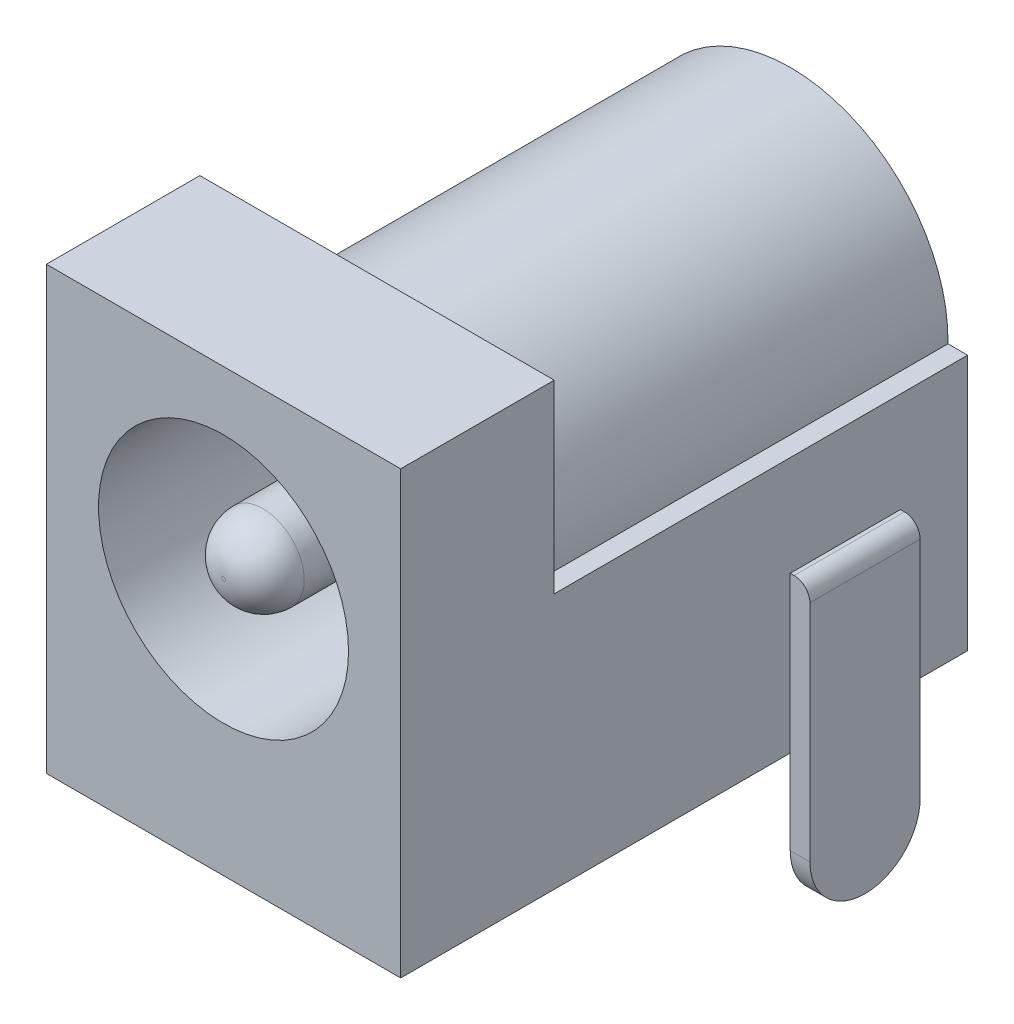
ISO-10303-21;
HEADER;
FILE_DESCRIPTION(('STEP AP214'),'2;1');
FILE_NAME('part.step','',(''),(''),'','','');
FILE_SCHEMA(('AUTOMOTIVE_DESIGN { 1 0 10303 214 1 1 1 1 }'));
ENDSEC;
DATA;
#1=APPLICATION_CONTEXT('core data for automotive mechanical design processes');
#2=APPLICATION_PROTOCOL_DEFINITION('international standard','automotive_design',2000,#1);
#3=PRODUCT_CONTEXT('',#1,'mechanical');
#4=PRODUCT('Part','Part','',(#3));
#5=PRODUCT_RELATED_PRODUCT_CATEGORY('part','',(#4));
#6=PRODUCT_DEFINITION_FORMATION('','',#4);
#7=PRODUCT_DEFINITION_CONTEXT('part definition',#1,'design');
#8=PRODUCT_DEFINITION('design','',#6,#7);
#9=PRODUCT_DEFINITION_SHAPE('','',#8);
#10=(LENGTH_UNIT() NAMED_UNIT(*) SI_UNIT(.MILLI.,.METRE.));
#11=(NAMED_UNIT(*) PLANE_ANGLE_UNIT() SI_UNIT($,.RADIAN.));
#12=(NAMED_UNIT(*) SI_UNIT($,.STERADIAN.) SOLID_ANGLE_UNIT());
#13=UNCERTAINTY_MEASURE_WITH_UNIT(LENGTH_MEASURE(1.E-05),#10,'distance_accuracy_value','');
#14=(GEOMETRIC_REPRESENTATION_CONTEXT(3) GLOBAL_UNCERTAINTY_ASSIGNED_CONTEXT((#13)) GLOBAL_UNIT_ASSIGNED_CONTEXT((#10,
#11,#12)) REPRESENTATION_CONTEXT('',''));
#15=CARTESIAN_POINT('',(0.,0.,0.));
#16=DIRECTION('',(0.,0.,1.));
#17=DIRECTION('',(1.,0.,0.));
#18=AXIS2_PLACEMENT_3D('',#15,#16,#17);
#19=CARTESIAN_POINT('',(9.04354924437719,4.,-9.85));
#20=DIRECTION('',(-1.,0.,0.));
#21=DIRECTION('',(0.,0.,1.));
#22=AXIS2_PLACEMENT_3D('',#19,#20,#21);
#23=PLANE('',#22);
#24=CARTESIAN_POINT('',(9.04354924437719,-2.1,-11.25));
#25=DIRECTION('',(-1.,0.,0.));
#26=DIRECTION('',(0.,0.,1.));
#27=AXIS2_PLACEMENT_3D('',#24,#25,#26);
#28=CIRCLE('',#27,1.4);
#29=CARTESIAN_POINT('',(9.04354924437719,-2.1,-12.65));
#30=VERTEX_POINT('',#29);
#31=CARTESIAN_POINT('',(9.04354924437719,-3.5,-11.25));
#32=VERTEX_POINT('',#31);
#33=EDGE_CURVE('E132',#30,#32,#28,.T.);
#34=ORIENTED_EDGE('',*,*,#33,.T.);
#35=CARTESIAN_POINT('',(9.04354924437719,-2.1,-11.25));
#36=DIRECTION('',(-1.,0.,0.));
#37=DIRECTION('',(0.,0.,1.));
#38=AXIS2_PLACEMENT_3D('',#35,#36,#37);
#39=CIRCLE('',#38,1.4);
#40=CARTESIAN_POINT('',(9.04354924437719,-2.1,-9.85));
#41=VERTEX_POINT('',#40);
#42=EDGE_CURVE('E134',#32,#41,#39,.T.);
#43=ORIENTED_EDGE('',*,*,#42,.T.);
#44=DIRECTION('',(0.,-1.,0.));
#45=VECTOR('',#44,1.);
#46=CARTESIAN_POINT('',(9.04354924437719,4.,-9.85));
#47=LINE('',#46,#45);
#48=CARTESIAN_POINT('',(9.04354924437719,4.,-9.85));
#49=VERTEX_POINT('',#48);
#50=EDGE_CURVE('E115',#49,#41,#47,.T.);
#51=ORIENTED_EDGE('',*,*,#50,.F.);
#52=DIRECTION('',(0.,0.,-1.));
#53=VECTOR('',#52,1.);
#54=CARTESIAN_POINT('',(9.04354924437719,4.,-9.85));
#55=LINE('',#54,#53);
#56=CARTESIAN_POINT('',(9.04354924437719,4.,-12.65));
#57=VERTEX_POINT('',#56);
#58=EDGE_CURVE('E109',#49,#57,#55,.T.);
#59=ORIENTED_EDGE('',*,*,#58,.T.);
#60=DIRECTION('',(0.,-1.,0.));
#61=VECTOR('',#60,1.);
#62=CARTESIAN_POINT('',(9.04354924437719,4.,-12.65));
#63=LINE('',#62,#61);
#64=EDGE_CURVE('E93',#57,#30,#63,.T.);
#65=ORIENTED_EDGE('',*,*,#64,.T.);
#66=EDGE_LOOP('',(#34,#43,#51,#59,#65));
#67=FACE_BOUND('',#66,.T.);
#68=ADVANCED_FACE('F42',(#67),#23,.T.);
#69=CARTESIAN_POINT('',(9.04354924437719,4.,-9.85));
#70=DIRECTION('',(0.,0.,1.));
#71=DIRECTION('',(1.,0.,0.));
#72=AXIS2_PLACEMENT_3D('',#69,#70,#71);
#73=PLANE('',#72);
#74=ORIENTED_EDGE('',*,*,#50,.T.);
#75=DIRECTION('',(-1.,0.,0.));
#76=VECTOR('',#75,1.);
#77=CARTESIAN_POINT('',(9.04354924437719,-2.1,-9.85));
#78=LINE('',#77,#76);
#79=CARTESIAN_POINT('',(9.54354924437719,-2.1,-9.85));
#80=VERTEX_POINT('',#79);
#81=EDGE_CURVE('E136',#41,#80,#78,.F.);
#82=ORIENTED_EDGE('',*,*,#81,.T.);
#83=DIRECTION('',(0.,-1.,0.));
#84=VECTOR('',#83,1.);
#85=CARTESIAN_POINT('',(9.54354924437719,4.,-9.85));
#86=LINE('',#85,#84);
#87=CARTESIAN_POINT('',(9.54354924437719,3.6,-9.85));
#88=VERTEX_POINT('',#87);
#89=EDGE_CURVE('E122',#88,#80,#86,.T.);
#90=ORIENTED_EDGE('',*,*,#89,.F.);
#91=CARTESIAN_POINT('',(9.14354924437719,3.6,-9.85));
#92=DIRECTION('',(0.,0.,1.));
#93=DIRECTION('',(1.,0.,0.));
#94=AXIS2_PLACEMENT_3D('',#91,#92,#93);
#95=CIRCLE('',#94,0.4);
#96=CARTESIAN_POINT('',(9.14354924437719,4.,-9.85));
#97=VERTEX_POINT('',#96);
#98=EDGE_CURVE('E127',#88,#97,#95,.T.);
#99=ORIENTED_EDGE('',*,*,#98,.T.);
#100=DIRECTION('',(-1.,0.,0.));
#101=VECTOR('',#100,1.);
#102=CARTESIAN_POINT('',(9.04354924437719,4.,-9.85));
#103=LINE('',#102,#101);
#104=EDGE_CURVE('E103',#97,#49,#103,.T.);
#105=ORIENTED_EDGE('',*,*,#104,.T.);
#106=EDGE_LOOP('',(#74,#82,#90,#99,#105));
#107=FACE_BOUND('',#106,.T.);
#108=ADVANCED_FACE('F143',(#107),#73,.T.);
#109=CARTESIAN_POINT('',(9.54354924437719,4.,-9.85));
#110=DIRECTION('',(1.,0.,0.));
#111=DIRECTION('',(0.,0.,-1.));
#112=AXIS2_PLACEMENT_3D('',#109,#110,#111);
#113=PLANE('',#112);
#114=ORIENTED_EDGE('',*,*,#89,.T.);
#115=CARTESIAN_POINT('',(9.54354924437719,-2.1,-11.25));
#116=DIRECTION('',(1.,0.,0.));
#117=DIRECTION('',(0.,0.,-1.));
#118=AXIS2_PLACEMENT_3D('',#115,#116,#117);
#119=CIRCLE('',#118,1.4);
#120=CARTESIAN_POINT('',(9.54354924437719,-3.5,-11.25));
#121=VERTEX_POINT('',#120);
#122=EDGE_CURVE('E51',#80,#121,#119,.T.);
#123=ORIENTED_EDGE('',*,*,#122,.T.);
#124=CARTESIAN_POINT('',(9.54354924437719,-2.1,-11.25));
#125=DIRECTION('',(1.,0.,0.));
#126=DIRECTION('',(0.,0.,-1.));
#127=AXIS2_PLACEMENT_3D('',#124,#125,#126);
#128=CIRCLE('',#127,1.4);
#129=CARTESIAN_POINT('',(9.54354924437719,-2.1,-12.65));
#130=VERTEX_POINT('',#129);
#131=EDGE_CURVE('E61',#121,#130,#128,.T.);
#132=ORIENTED_EDGE('',*,*,#131,.T.);
#133=DIRECTION('',(0.,-1.,0.));
#134=VECTOR('',#133,1.);
#135=CARTESIAN_POINT('',(9.54354924437719,4.,-12.65));
#136=LINE('',#135,#134);
#137=CARTESIAN_POINT('',(9.54354924437719,3.6,-12.65));
#138=VERTEX_POINT('',#137);
#139=EDGE_CURVE('E102',#138,#130,#136,.T.);
#140=ORIENTED_EDGE('',*,*,#139,.F.);
#141=DIRECTION('',(0.,0.,1.));
#142=VECTOR('',#141,1.);
#143=CARTESIAN_POINT('',(9.54354924437719,3.6,-9.85));
#144=LINE('',#143,#142);
#145=EDGE_CURVE('E121',#138,#88,#144,.T.);
#146=ORIENTED_EDGE('',*,*,#145,.T.);
#147=EDGE_LOOP('',(#114,#123,#132,#140,#146));
#148=FACE_BOUND('',#147,.T.);
#149=ADVANCED_FACE('F146',(#148),#113,.T.);
#150=CARTESIAN_POINT('',(9.04354924437719,4.,-12.65));
#151=DIRECTION('',(0.,0.,-1.));
#152=DIRECTION('',(-1.,0.,0.));
#153=AXIS2_PLACEMENT_3D('',#150,#151,#152);
#154=PLANE('',#153);
#155=ORIENTED_EDGE('',*,*,#139,.T.);
#156=DIRECTION('',(1.,0.,0.));
#157=VECTOR('',#156,1.);
#158=CARTESIAN_POINT('',(9.04354924437719,-2.1,-12.65));
#159=LINE('',#158,#157);
#160=EDGE_CURVE('E12',#130,#30,#159,.F.);
#161=ORIENTED_EDGE('',*,*,#160,.T.);
#162=ORIENTED_EDGE('',*,*,#64,.F.);
#163=DIRECTION('',(1.,0.,0.));
#164=VECTOR('',#163,1.);
#165=CARTESIAN_POINT('',(9.04354924437719,4.,-12.65));
#166=LINE('',#165,#164);
#167=CARTESIAN_POINT('',(9.14354924437719,4.,-12.65));
#168=VERTEX_POINT('',#167);
#169=EDGE_CURVE('E96',#57,#168,#166,.T.);
#170=ORIENTED_EDGE('',*,*,#169,.T.);
#171=CARTESIAN_POINT('',(9.14354924437719,3.6,-12.65));
#172=DIRECTION('',(0.,0.,-1.));
#173=DIRECTION('',(-1.,0.,0.));
#174=AXIS2_PLACEMENT_3D('',#171,#172,#173);
#175=CIRCLE('',#174,0.4);
#176=EDGE_CURVE('E130',#168,#138,#175,.T.);
#177=ORIENTED_EDGE('',*,*,#176,.T.);
#178=EDGE_LOOP('',(#155,#161,#162,#170,#177));
#179=FACE_BOUND('',#178,.T.);
#180=ADVANCED_FACE('F95',(#179),#154,.T.);
#181=CARTESIAN_POINT('',(0.,4.,0.));
#182=DIRECTION('',(0.,-1.,0.));
#183=DIRECTION('',(0.,0.,-1.));
#184=AXIS2_PLACEMENT_3D('',#181,#182,#183);
#185=PLANE('',#184);
#186=ORIENTED_EDGE('',*,*,#104,.F.);
#187=DIRECTION('',(0.,0.,1.));
#188=VECTOR('',#187,1.);
#189=CARTESIAN_POINT('',(9.14354924437719,4.,-12.65));
#190=LINE('',#189,#188);
#191=EDGE_CURVE('E111',#97,#168,#190,.F.);
#192=ORIENTED_EDGE('',*,*,#191,.T.);
#193=ORIENTED_EDGE('',*,*,#169,.F.);
#194=ORIENTED_EDGE('',*,*,#58,.F.);
#195=EDGE_LOOP('',(#186,#192,#193,#194));
#196=FACE_BOUND('',#195,.T.);
#197=ADVANCED_FACE('F108',(#196),#185,.F.);
#198=CARTESIAN_POINT('',(9.14354924437719,3.6,-9.85));
#199=DIRECTION('',(0.,0.,-1.));
#200=DIRECTION('',(-1.,0.,0.));
#201=AXIS2_PLACEMENT_3D('',#198,#199,#200);
#202=CYLINDRICAL_SURFACE('',#201,0.4);
#203=ORIENTED_EDGE('',*,*,#176,.F.);
#204=ORIENTED_EDGE('',*,*,#191,.F.);
#205=ORIENTED_EDGE('',*,*,#98,.F.);
#206=ORIENTED_EDGE('',*,*,#145,.F.);
#207=EDGE_LOOP('',(#203,#204,#205,#206));
#208=FACE_BOUND('',#207,.T.);
#209=ADVANCED_FACE('F149',(#208),#202,.T.);
#210=CARTESIAN_POINT('',(0.,-2.1,-11.25));
#211=DIRECTION('',(1.,0.,0.));
#212=DIRECTION('',(0.,0.,-1.));
#213=AXIS2_PLACEMENT_3D('',#210,#211,#212);
#214=CYLINDRICAL_SURFACE('',#213,1.4);
#215=ORIENTED_EDGE('',*,*,#160,.F.);
#216=ORIENTED_EDGE('',*,*,#131,.F.);
#217=DIRECTION('',(1.,0.,0.));
#218=VECTOR('',#217,1.);
#219=CARTESIAN_POINT('',(0.,-3.5,-11.25));
#220=LINE('',#219,#218);
#221=EDGE_CURVE('E46',#32,#121,#220,.T.);
#222=ORIENTED_EDGE('',*,*,#221,.F.);
#223=ORIENTED_EDGE('',*,*,#33,.F.);
#224=EDGE_LOOP('',(#215,#216,#222,#223));
#225=FACE_BOUND('',#224,.T.);
#226=ADVANCED_FACE('F44',(#225),#214,.T.);
#227=CARTESIAN_POINT('',(0.,-2.1,-11.25));
#228=DIRECTION('',(-1.,0.,0.));
#229=DIRECTION('',(0.,0.,1.));
#230=AXIS2_PLACEMENT_3D('',#227,#228,#229);
#231=CYLINDRICAL_SURFACE('',#230,1.4);
#232=ORIENTED_EDGE('',*,*,#122,.F.);
#233=ORIENTED_EDGE('',*,*,#81,.F.);
#234=ORIENTED_EDGE('',*,*,#42,.F.);
#235=ORIENTED_EDGE('',*,*,#221,.T.);
#236=EDGE_LOOP('',(#232,#233,#234,#235));
#237=FACE_BOUND('',#236,.T.);
#238=ADVANCED_FACE('F152',(#237),#231,.T.);
#239=CLOSED_SHELL('',(#68,#108,#149,#180,#197,#209,#226,#238));
#240=MANIFOLD_SOLID_BREP('B2',#239);
#241=CARTESIAN_POINT('',(4.5,6.525,-10.));
#242=DIRECTION('',(0.,0.,1.));
#243=DIRECTION('',(1.,0.,0.));
#244=AXIS2_PLACEMENT_3D('',#241,#242,#243);
#245=PLANE('',#244);
#246=CARTESIAN_POINT('',(4.5,6.525,-10.));
#247=DIRECTION('',(0.,0.,1.));
#248=DIRECTION('',(1.,0.,0.));
#249=AXIS2_PLACEMENT_3D('',#246,#247,#248);
#250=CIRCLE('',#249,3.175);
#251=CARTESIAN_POINT('',(7.675,6.525,-10.));
#252=VERTEX_POINT('',#251);
#253=EDGE_CURVE('E473',#252,#252,#250,.T.);
#254=ORIENTED_EDGE('',*,*,#253,.T.);
#255=EDGE_LOOP('',(#254));
#256=FACE_BOUND('',#255,.T.);
#257=CARTESIAN_POINT('',(4.5,6.525,-10.));
#258=DIRECTION('',(0.,0.,1.));
#259=DIRECTION('',(1.,0.,0.));
#260=AXIS2_PLACEMENT_3D('',#257,#258,#259);
#261=CIRCLE('',#260,1.05);
#262=CARTESIAN_POINT('',(5.55,6.525,-10.));
#263=VERTEX_POINT('',#262);
#264=EDGE_CURVE('E463',#263,#263,#261,.T.);
#265=ORIENTED_EDGE('',*,*,#264,.F.);
#266=EDGE_LOOP('',(#265));
#267=FACE_BOUND('',#266,.T.);
#268=ADVANCED_FACE('F217',(#256,#267),#245,.T.);
#269=CARTESIAN_POINT('',(0.,11.2,0.));
#270=DIRECTION('',(1.,0.,0.));
#271=DIRECTION('',(0.,0.,-1.));
#272=AXIS2_PLACEMENT_3D('',#269,#270,#271);
#273=PLANE('',#272);
#274=DIRECTION('',(0.,1.,0.));
#275=VECTOR('',#274,1.);
#276=CARTESIAN_POINT('',(0.,11.2,-3.9));
#277=LINE('',#276,#275);
#278=CARTESIAN_POINT('',(0.,6.5,-3.9));
#279=VERTEX_POINT('',#278);
#280=CARTESIAN_POINT('',(0.,11.2,-3.9));
#281=VERTEX_POINT('',#280);
#282=EDGE_CURVE('E447',#279,#281,#277,.T.);
#283=ORIENTED_EDGE('',*,*,#282,.F.);
#284=DIRECTION('',(0.,0.,-1.));
#285=VECTOR('',#284,1.);
#286=CARTESIAN_POINT('',(0.,6.5,-3.9));
#287=LINE('',#286,#285);
#288=CARTESIAN_POINT('',(0.,6.5,-14.4));
#289=VERTEX_POINT('',#288);
#290=EDGE_CURVE('E464',#279,#289,#287,.T.);
#291=ORIENTED_EDGE('',*,*,#290,.T.);
#292=DIRECTION('',(0.,-1.,0.));
#293=VECTOR('',#292,1.);
#294=CARTESIAN_POINT('',(0.,11.2,-14.4));
#295=LINE('',#294,#293);
#296=CARTESIAN_POINT('',(0.,0.,-14.4));
#297=VERTEX_POINT('',#296);
#298=EDGE_CURVE('E487',#289,#297,#295,.T.);
#299=ORIENTED_EDGE('',*,*,#298,.T.);
#300=DIRECTION('',(0.,0.,1.));
#301=VECTOR('',#300,1.);
#302=CARTESIAN_POINT('',(0.,0.,0.));
#303=LINE('',#302,#301);
#304=CARTESIAN_POINT('',(0.,0.,0.));
#305=VERTEX_POINT('',#304);
#306=EDGE_CURVE('E476',#297,#305,#303,.T.);
#307=ORIENTED_EDGE('',*,*,#306,.T.);
#308=DIRECTION('',(0.,-1.,0.));
#309=VECTOR('',#308,1.);
#310=CARTESIAN_POINT('',(0.,11.2,0.));
#311=LINE('',#310,#309);
#312=CARTESIAN_POINT('',(0.,11.2,0.));
#313=VERTEX_POINT('',#312);
#314=EDGE_CURVE('E503',#313,#305,#311,.T.);
#315=ORIENTED_EDGE('',*,*,#314,.F.);
#316=DIRECTION('',(0.,0.,1.));
#317=VECTOR('',#316,1.);
#318=CARTESIAN_POINT('',(0.,11.2,0.));
#319=LINE('',#318,#317);
#320=EDGE_CURVE('E479',#281,#313,#319,.T.);
#321=ORIENTED_EDGE('',*,*,#320,.F.);
#322=EDGE_LOOP('',(#283,#291,#299,#307,#315,#321));
#323=FACE_BOUND('',#322,.T.);
#324=ADVANCED_FACE('F577',(#323),#273,.F.);
#325=CARTESIAN_POINT('',(0.,11.2,0.));
#326=DIRECTION('',(0.,0.,-1.));
#327=DIRECTION('',(-1.,0.,0.));
#328=AXIS2_PLACEMENT_3D('',#325,#326,#327);
#329=PLANE('',#328);
#330=CARTESIAN_POINT('',(4.5,6.525,0.));
#331=DIRECTION('',(0.,0.,1.));
#332=DIRECTION('',(1.,0.,0.));
#333=AXIS2_PLACEMENT_3D('',#330,#331,#332);
#334=CIRCLE('',#333,3.175);
#335=CARTESIAN_POINT('',(7.675,6.525,0.));
#336=VERTEX_POINT('',#335);
#337=EDGE_CURVE('E472',#336,#336,#334,.T.);
#338=ORIENTED_EDGE('',*,*,#337,.F.);
#339=EDGE_LOOP('',(#338));
#340=FACE_BOUND('',#339,.T.);
#341=DIRECTION('',(1.,0.,0.));
#342=VECTOR('',#341,1.);
#343=CARTESIAN_POINT('',(0.,0.,0.));
#344=LINE('',#343,#342);
#345=CARTESIAN_POINT('',(9.,0.,0.));
#346=VERTEX_POINT('',#345);
#347=EDGE_CURVE('E490',#305,#346,#344,.T.);
#348=ORIENTED_EDGE('',*,*,#347,.T.);
#349=DIRECTION('',(0.,-1.,0.));
#350=VECTOR('',#349,1.);
#351=CARTESIAN_POINT('',(9.,11.2,0.));
#352=LINE('',#351,#350);
#353=CARTESIAN_POINT('',(9.,11.2,0.));
#354=VERTEX_POINT('',#353);
#355=EDGE_CURVE('E500',#354,#346,#352,.T.);
#356=ORIENTED_EDGE('',*,*,#355,.F.);
#357=DIRECTION('',(1.,0.,0.));
#358=VECTOR('',#357,1.);
#359=CARTESIAN_POINT('',(0.,11.2,0.));
#360=LINE('',#359,#358);
#361=EDGE_CURVE('E481',#313,#354,#360,.T.);
#362=ORIENTED_EDGE('',*,*,#361,.F.);
#363=ORIENTED_EDGE('',*,*,#314,.T.);
#364=EDGE_LOOP('',(#348,#356,#362,#363));
#365=FACE_BOUND('',#364,.T.);
#366=ADVANCED_FACE('F583',(#340,#365),#329,.F.);
#367=CARTESIAN_POINT('',(9.,11.2,0.));
#368=DIRECTION('',(-1.,0.,0.));
#369=DIRECTION('',(0.,0.,1.));
#370=AXIS2_PLACEMENT_3D('',#367,#368,#369);
#371=PLANE('',#370);
#372=DIRECTION('',(0.,-1.,0.));
#373=VECTOR('',#372,1.);
#374=CARTESIAN_POINT('',(9.,11.2,-14.4));
#375=LINE('',#374,#373);
#376=CARTESIAN_POINT('',(9.,6.5,-14.4));
#377=VERTEX_POINT('',#376);
#378=CARTESIAN_POINT('',(9.,0.,-14.4));
#379=VERTEX_POINT('',#378);
#380=EDGE_CURVE('E498',#377,#379,#375,.T.);
#381=ORIENTED_EDGE('',*,*,#380,.F.);
#382=DIRECTION('',(0.,0.,-1.));
#383=VECTOR('',#382,1.);
#384=CARTESIAN_POINT('',(9.,6.5,-3.9));
#385=LINE('',#384,#383);
#386=CARTESIAN_POINT('',(9.,6.5,-3.9));
#387=VERTEX_POINT('',#386);
#388=EDGE_CURVE('E461',#387,#377,#385,.T.);
#389=ORIENTED_EDGE('',*,*,#388,.F.);
#390=DIRECTION('',(0.,-1.,0.));
#391=VECTOR('',#390,1.);
#392=CARTESIAN_POINT('',(9.,6.5,-3.9));
#393=LINE('',#392,#391);
#394=CARTESIAN_POINT('',(9.,11.2,-3.9));
#395=VERTEX_POINT('',#394);
#396=EDGE_CURVE('E451',#395,#387,#393,.T.);
#397=ORIENTED_EDGE('',*,*,#396,.F.);
#398=DIRECTION('',(0.,0.,-1.));
#399=VECTOR('',#398,1.);
#400=CARTESIAN_POINT('',(9.,11.2,0.));
#401=LINE('',#400,#399);
#402=EDGE_CURVE('E484',#354,#395,#401,.T.);
#403=ORIENTED_EDGE('',*,*,#402,.F.);
#404=ORIENTED_EDGE('',*,*,#355,.T.);
#405=DIRECTION('',(0.,0.,-1.));
#406=VECTOR('',#405,1.);
#407=CARTESIAN_POINT('',(9.,0.,0.));
#408=LINE('',#407,#406);
#409=EDGE_CURVE('E492',#346,#379,#408,.T.);
#410=ORIENTED_EDGE('',*,*,#409,.T.);
#411=EDGE_LOOP('',(#381,#389,#397,#403,#404,#410));
#412=FACE_BOUND('',#411,.T.);
#413=ADVANCED_FACE('F604',(#412),#371,.F.);
#414=CARTESIAN_POINT('',(0.,11.2,-14.4));
#415=DIRECTION('',(0.,0.,1.));
#416=DIRECTION('',(1.,0.,0.));
#417=AXIS2_PLACEMENT_3D('',#414,#415,#416);
#418=PLANE('',#417);
#419=CARTESIAN_POINT('',(4.5,6.57744832748208,-14.4));
#420=DIRECTION('',(0.,0.,1.));
#421=DIRECTION('',(1.,0.,0.));
#422=AXIS2_PLACEMENT_3D('',#419,#420,#421);
#423=CIRCLE('',#422,4.00074971017055);
#424=CARTESIAN_POINT('',(8.5,6.5,-14.4));
#425=VERTEX_POINT('',#424);
#426=CARTESIAN_POINT('',(0.5,6.5,-14.4));
#427=VERTEX_POINT('',#426);
#428=EDGE_CURVE('E457',#425,#427,#423,.T.);
#429=ORIENTED_EDGE('',*,*,#428,.F.);
#430=DIRECTION('',(-1.,0.,0.));
#431=VECTOR('',#430,1.);
#432=CARTESIAN_POINT('',(9.,6.5,-14.4));
#433=LINE('',#432,#431);
#434=EDGE_CURVE('E436',#377,#425,#433,.T.);
#435=ORIENTED_EDGE('',*,*,#434,.F.);
#436=ORIENTED_EDGE('',*,*,#380,.T.);
#437=DIRECTION('',(-1.,0.,0.));
#438=VECTOR('',#437,1.);
#439=CARTESIAN_POINT('',(0.,0.,-14.4));
#440=LINE('',#439,#438);
#441=EDGE_CURVE('E482',#379,#297,#440,.T.);
#442=ORIENTED_EDGE('',*,*,#441,.T.);
#443=ORIENTED_EDGE('',*,*,#298,.F.);
#444=DIRECTION('',(-1.,0.,0.));
#445=VECTOR('',#444,1.);
#446=CARTESIAN_POINT('',(0.,6.5,-14.4));
#447=LINE('',#446,#445);
#448=EDGE_CURVE('E441',#427,#289,#447,.T.);
#449=ORIENTED_EDGE('',*,*,#448,.F.);
#450=EDGE_LOOP('',(#429,#435,#436,#442,#443,#449));
#451=FACE_BOUND('',#450,.T.);
#452=ADVANCED_FACE('F598',(#451),#418,.F.);
#453=CARTESIAN_POINT('',(0.,11.2,0.));
#454=DIRECTION('',(0.,-1.,0.));
#455=DIRECTION('',(0.,0.,-1.));
#456=AXIS2_PLACEMENT_3D('',#453,#454,#455);
#457=PLANE('',#456);
#458=ORIENTED_EDGE('',*,*,#402,.T.);
#459=DIRECTION('',(1.,0.,0.));
#460=VECTOR('',#459,1.);
#461=CARTESIAN_POINT('',(9.,11.2,-3.9));
#462=LINE('',#461,#460);
#463=EDGE_CURVE('E449',#281,#395,#462,.T.);
#464=ORIENTED_EDGE('',*,*,#463,.F.);
#465=ORIENTED_EDGE('',*,*,#320,.T.);
#466=ORIENTED_EDGE('',*,*,#361,.T.);
#467=EDGE_LOOP('',(#458,#464,#465,#466));
#468=FACE_BOUND('',#467,.T.);
#469=ADVANCED_FACE('F595',(#468),#457,.F.);
#470=CARTESIAN_POINT('',(0.,0.,0.));
#471=DIRECTION('',(0.,-1.,0.));
#472=DIRECTION('',(0.,0.,-1.));
#473=AXIS2_PLACEMENT_3D('',#470,#471,#472);
#474=PLANE('',#473);
#475=DIRECTION('',(0.,0.,-1.));
#476=VECTOR('',#475,1.);
#477=CARTESIAN_POINT('',(3.1,0.,0.));
#478=LINE('',#477,#476);
#479=CARTESIAN_POINT('',(3.1,0.,-13.5));
#480=VERTEX_POINT('',#479);
#481=CARTESIAN_POINT('',(3.1,0.,-14.));
#482=VERTEX_POINT('',#481);
#483=EDGE_CURVE('E524',#480,#482,#478,.T.);
#484=ORIENTED_EDGE('',*,*,#483,.F.);
#485=DIRECTION('',(-1.,0.,0.));
#486=VECTOR('',#485,1.);
#487=CARTESIAN_POINT('',(0.,0.,-13.5));
#488=LINE('',#487,#486);
#489=CARTESIAN_POINT('',(5.9,0.,-13.5));
#490=VERTEX_POINT('',#489);
#491=EDGE_CURVE('E370',#490,#480,#488,.T.);
#492=ORIENTED_EDGE('',*,*,#491,.F.);
#493=DIRECTION('',(0.,0.,1.));
#494=VECTOR('',#493,1.);
#495=CARTESIAN_POINT('',(5.89999999999998,0.,0.));
#496=LINE('',#495,#494);
#497=CARTESIAN_POINT('',(5.9,0.,-14.));
#498=VERTEX_POINT('',#497);
#499=EDGE_CURVE('E363',#498,#490,#496,.T.);
#500=ORIENTED_EDGE('',*,*,#499,.F.);
#501=DIRECTION('',(1.,0.,0.));
#502=VECTOR('',#501,1.);
#503=CARTESIAN_POINT('',(0.,0.,-14.));
#504=LINE('',#503,#502);
#505=EDGE_CURVE('E367',#482,#498,#504,.T.);
#506=ORIENTED_EDGE('',*,*,#505,.F.);
#507=EDGE_LOOP('',(#484,#492,#500,#506));
#508=FACE_BOUND('',#507,.T.);
#509=DIRECTION('',(0.,0.,-1.));
#510=VECTOR('',#509,1.);
#511=CARTESIAN_POINT('',(3.1,0.,0.));
#512=LINE('',#511,#510);
#513=CARTESIAN_POINT('',(3.1,0.,-8.5));
#514=VERTEX_POINT('',#513);
#515=CARTESIAN_POINT('',(3.1,0.,-9.));
#516=VERTEX_POINT('',#515);
#517=EDGE_CURVE('E433',#514,#516,#512,.T.);
#518=ORIENTED_EDGE('',*,*,#517,.F.);
#519=DIRECTION('',(-1.,0.,0.));
#520=VECTOR('',#519,1.);
#521=CARTESIAN_POINT('',(0.,0.,-8.5));
#522=LINE('',#521,#520);
#523=CARTESIAN_POINT('',(5.9,0.,-8.5));
#524=VERTEX_POINT('',#523);
#525=EDGE_CURVE('E430',#524,#514,#522,.T.);
#526=ORIENTED_EDGE('',*,*,#525,.F.);
#527=DIRECTION('',(0.,0.,1.));
#528=VECTOR('',#527,1.);
#529=CARTESIAN_POINT('',(5.9,0.,0.));
#530=LINE('',#529,#528);
#531=CARTESIAN_POINT('',(5.9,0.,-9.));
#532=VERTEX_POINT('',#531);
#533=EDGE_CURVE('E427',#532,#524,#530,.T.);
#534=ORIENTED_EDGE('',*,*,#533,.F.);
#535=DIRECTION('',(1.,0.,0.));
#536=VECTOR('',#535,1.);
#537=CARTESIAN_POINT('',(0.,0.,-9.00000000000001));
#538=LINE('',#537,#536);
#539=EDGE_CURVE('E413',#516,#532,#538,.T.);
#540=ORIENTED_EDGE('',*,*,#539,.F.);
#541=EDGE_LOOP('',(#518,#526,#534,#540));
#542=FACE_BOUND('',#541,.T.);
#543=ORIENTED_EDGE('',*,*,#306,.F.);
#544=ORIENTED_EDGE('',*,*,#441,.F.);
#545=ORIENTED_EDGE('',*,*,#409,.F.);
#546=ORIENTED_EDGE('',*,*,#347,.F.);
#547=EDGE_LOOP('',(#543,#544,#545,#546));
#548=FACE_BOUND('',#547,.T.);
#549=ADVANCED_FACE('F365',(#508,#542,#548),#474,.T.);
#550=CARTESIAN_POINT('',(4.5,6.525,-10.));
#551=DIRECTION('',(0.,0.,1.));
#552=DIRECTION('',(1.,0.,0.));
#553=AXIS2_PLACEMENT_3D('',#550,#551,#552);
#554=CYLINDRICAL_SURFACE('',#553,3.175);
#555=CARTESIAN_POINT('',(4.5,6.525,-8.5));
#556=DIRECTION('',(0.,0.,1.));
#557=DIRECTION('',(1.,0.,0.));
#558=AXIS2_PLACEMENT_3D('',#555,#556,#557);
#559=CIRCLE('',#558,3.175);
#560=CARTESIAN_POINT('',(5.9,3.67532896635419,-8.5));
#561=VERTEX_POINT('',#560);
#562=CARTESIAN_POINT('',(3.1,3.67532896635419,-8.5));
#563=VERTEX_POINT('',#562);
#564=EDGE_CURVE('E518',#561,#563,#559,.F.);
#565=ORIENTED_EDGE('',*,*,#564,.T.);
#566=DIRECTION('',(0.,0.,1.));
#567=VECTOR('',#566,1.);
#568=CARTESIAN_POINT('',(3.1,3.67532896635419,-10.));
#569=LINE('',#568,#567);
#570=CARTESIAN_POINT('',(3.1,3.67532896635419,-9.));
#571=VERTEX_POINT('',#570);
#572=EDGE_CURVE('E384',#563,#571,#569,.F.);
#573=ORIENTED_EDGE('',*,*,#572,.T.);
#574=CARTESIAN_POINT('',(4.5,6.525,-9.));
#575=DIRECTION('',(0.,0.,-1.));
#576=DIRECTION('',(-1.,0.,0.));
#577=AXIS2_PLACEMENT_3D('',#574,#575,#576);
#578=CIRCLE('',#577,3.175);
#579=CARTESIAN_POINT('',(5.9,3.67532896635419,-9.));
#580=VERTEX_POINT('',#579);
#581=EDGE_CURVE('E512',#571,#580,#578,.F.);
#582=ORIENTED_EDGE('',*,*,#581,.T.);
#583=DIRECTION('',(0.,0.,1.));
#584=VECTOR('',#583,1.);
#585=CARTESIAN_POINT('',(5.9,3.67532896635419,-10.));
#586=LINE('',#585,#584);
#587=EDGE_CURVE('E515',#580,#561,#586,.T.);
#588=ORIENTED_EDGE('',*,*,#587,.T.);
#589=EDGE_LOOP('',(#565,#573,#582,#588));
#590=FACE_BOUND('',#589,.T.);
#591=ORIENTED_EDGE('',*,*,#253,.F.);
#592=EDGE_LOOP('',(#591));
#593=FACE_BOUND('',#592,.T.);
#594=ORIENTED_EDGE('',*,*,#337,.T.);
#595=EDGE_LOOP('',(#594));
#596=FACE_BOUND('',#595,.T.);
#597=ADVANCED_FACE('F591',(#590,#593,#596),#554,.F.);
#598=CARTESIAN_POINT('',(4.5,6.525,0.));
#599=DIRECTION('',(0.,0.,-1.));
#600=DIRECTION('',(-1.,0.,0.));
#601=AXIS2_PLACEMENT_3D('',#598,#599,#600);
#602=CYLINDRICAL_SURFACE('',#601,1.05);
#603=CARTESIAN_POINT('',(4.5,6.525,-1.));
#604=DIRECTION('',(0.,0.,1.));
#605=DIRECTION('',(1.,0.,0.));
#606=AXIS2_PLACEMENT_3D('',#603,#604,#605);
#607=CIRCLE('',#606,1.05);
#608=CARTESIAN_POINT('',(5.55,6.525,-1.));
#609=VERTEX_POINT('',#608);
#610=EDGE_CURVE('E509',#609,#609,#607,.F.);
#611=ORIENTED_EDGE('',*,*,#610,.T.);
#612=EDGE_LOOP('',(#611));
#613=FACE_BOUND('',#612,.T.);
#614=ORIENTED_EDGE('',*,*,#264,.T.);
#615=EDGE_LOOP('',(#614));
#616=FACE_BOUND('',#615,.T.);
#617=ADVANCED_FACE('F589',(#613,#616),#602,.T.);
#618=CARTESIAN_POINT('',(4.5,6.525,0.));
#619=DIRECTION('',(0.,0.,1.));
#620=DIRECTION('',(1.,0.,0.));
#621=AXIS2_PLACEMENT_3D('',#618,#619,#620);
#622=PLANE('',#621);
#623=CARTESIAN_POINT('',(4.5,6.525,0.));
#624=DIRECTION('',(0.,0.,1.));
#625=DIRECTION('',(1.,0.,0.));
#626=AXIS2_PLACEMENT_3D('',#623,#624,#625);
#627=CIRCLE('',#626,0.0500000000000006);
#628=CARTESIAN_POINT('',(4.55,6.525,0.));
#629=VERTEX_POINT('',#628);
#630=EDGE_CURVE('E506',#629,#629,#627,.T.);
#631=ORIENTED_EDGE('',*,*,#630,.T.);
#632=EDGE_LOOP('',(#631));
#633=FACE_BOUND('',#632,.T.);
#634=ADVANCED_FACE('F616',(#633),#622,.T.);
#635=CARTESIAN_POINT('',(4.5,6.525,-1.));
#636=DIRECTION('',(0.,0.,1.));
#637=DIRECTION('',(1.,0.,0.));
#638=AXIS2_PLACEMENT_3D('',#635,#636,#637);
#639=DEGENERATE_TOROIDAL_SURFACE('',#638,0.0500000000000006,1.,.T.);
#640=ORIENTED_EDGE('',*,*,#610,.F.);
#641=EDGE_LOOP('',(#640));
#642=FACE_BOUND('',#641,.T.);
#643=ORIENTED_EDGE('',*,*,#630,.F.);
#644=EDGE_LOOP('',(#643));
#645=FACE_BOUND('',#644,.T.);
#646=ADVANCED_FACE('F612',(#642,#645),#639,.T.);
#647=CARTESIAN_POINT('',(9.,6.5,-3.9));
#648=DIRECTION('',(0.,-1.,0.));
#649=DIRECTION('',(0.,0.,-1.));
#650=AXIS2_PLACEMENT_3D('',#647,#648,#649);
#651=PLANE('',#650);
#652=ORIENTED_EDGE('',*,*,#434,.T.);
#653=DIRECTION('',(0.,0.,-1.));
#654=VECTOR('',#653,1.);
#655=CARTESIAN_POINT('',(8.5,6.5,-3.9));
#656=LINE('',#655,#654);
#657=CARTESIAN_POINT('',(8.5,6.5,-3.9));
#658=VERTEX_POINT('',#657);
#659=EDGE_CURVE('E454',#658,#425,#656,.T.);
#660=ORIENTED_EDGE('',*,*,#659,.F.);
#661=DIRECTION('',(-1.,0.,0.));
#662=VECTOR('',#661,1.);
#663=CARTESIAN_POINT('',(9.,6.5,-3.9));
#664=LINE('',#663,#662);
#665=EDGE_CURVE('E437',#387,#658,#664,.T.);
#666=ORIENTED_EDGE('',*,*,#665,.F.);
#667=ORIENTED_EDGE('',*,*,#388,.T.);
#668=EDGE_LOOP('',(#652,#660,#666,#667));
#669=FACE_BOUND('',#668,.T.);
#670=ADVANCED_FACE('F615',(#669),#651,.F.);
#671=CARTESIAN_POINT('',(0.,6.5,-3.9));
#672=DIRECTION('',(0.,-1.,0.));
#673=DIRECTION('',(0.,0.,-1.));
#674=AXIS2_PLACEMENT_3D('',#671,#672,#673);
#675=PLANE('',#674);
#676=ORIENTED_EDGE('',*,*,#448,.T.);
#677=ORIENTED_EDGE('',*,*,#290,.F.);
#678=DIRECTION('',(-1.,0.,0.));
#679=VECTOR('',#678,1.);
#680=CARTESIAN_POINT('',(0.,6.5,-3.9));
#681=LINE('',#680,#679);
#682=CARTESIAN_POINT('',(0.5,6.5,-3.9));
#683=VERTEX_POINT('',#682);
#684=EDGE_CURVE('E444',#683,#279,#681,.T.);
#685=ORIENTED_EDGE('',*,*,#684,.F.);
#686=DIRECTION('',(0.,0.,-1.));
#687=VECTOR('',#686,1.);
#688=CARTESIAN_POINT('',(0.5,6.5,-3.9));
#689=LINE('',#688,#687);
#690=EDGE_CURVE('E467',#683,#427,#689,.T.);
#691=ORIENTED_EDGE('',*,*,#690,.T.);
#692=EDGE_LOOP('',(#676,#677,#685,#691));
#693=FACE_BOUND('',#692,.T.);
#694=ADVANCED_FACE('F667',(#693),#675,.F.);
#695=CARTESIAN_POINT('',(4.5,6.57744832748208,-3.9));
#696=DIRECTION('',(0.,0.,-1.));
#697=DIRECTION('',(-1.,0.,0.));
#698=AXIS2_PLACEMENT_3D('',#695,#696,#697);
#699=CYLINDRICAL_SURFACE('',#698,4.00074971017055);
#700=ORIENTED_EDGE('',*,*,#428,.T.);
#701=ORIENTED_EDGE('',*,*,#690,.F.);
#702=CARTESIAN_POINT('',(4.5,6.57744832748208,-3.9));
#703=DIRECTION('',(0.,0.,1.));
#704=DIRECTION('',(1.,0.,0.));
#705=AXIS2_PLACEMENT_3D('',#702,#703,#704);
#706=CIRCLE('',#705,4.00074971017055);
#707=EDGE_CURVE('E440',#658,#683,#706,.T.);
#708=ORIENTED_EDGE('',*,*,#707,.F.);
#709=ORIENTED_EDGE('',*,*,#659,.T.);
#710=EDGE_LOOP('',(#700,#701,#708,#709));
#711=FACE_BOUND('',#710,.T.);
#712=ADVANCED_FACE('F665',(#711),#699,.T.);
#713=CARTESIAN_POINT('',(4.5,6.57744832748208,-3.9));
#714=DIRECTION('',(0.,0.,1.));
#715=DIRECTION('',(1.,0.,0.));
#716=AXIS2_PLACEMENT_3D('',#713,#714,#715);
#717=PLANE('',#716);
#718=ORIENTED_EDGE('',*,*,#665,.T.);
#719=ORIENTED_EDGE('',*,*,#707,.T.);
#720=ORIENTED_EDGE('',*,*,#684,.T.);
#721=ORIENTED_EDGE('',*,*,#282,.T.);
#722=ORIENTED_EDGE('',*,*,#463,.T.);
#723=ORIENTED_EDGE('',*,*,#396,.T.);
#724=EDGE_LOOP('',(#718,#719,#720,#721,#722,#723));
#725=FACE_BOUND('',#724,.T.);
#726=ADVANCED_FACE('F650',(#725),#717,.F.);
#727=CARTESIAN_POINT('',(0.,4.,0.));
#728=DIRECTION('',(0.,-1.,0.));
#729=DIRECTION('',(0.,0.,-1.));
#730=AXIS2_PLACEMENT_3D('',#727,#728,#729);
#731=PLANE('',#730);
#732=DIRECTION('',(0.,0.,-1.));
#733=VECTOR('',#732,1.);
#734=CARTESIAN_POINT('',(3.1,4.,-8.5));
#735=LINE('',#734,#733);
#736=CARTESIAN_POINT('',(3.1,4.,-8.5));
#737=VERTEX_POINT('',#736);
#738=CARTESIAN_POINT('',(3.1,4.,-9.));
#739=VERTEX_POINT('',#738);
#740=EDGE_CURVE('E397',#737,#739,#735,.T.);
#741=ORIENTED_EDGE('',*,*,#740,.F.);
#742=DIRECTION('',(-1.,0.,0.));
#743=VECTOR('',#742,1.);
#744=CARTESIAN_POINT('',(3.1,4.,-8.5));
#745=LINE('',#744,#743);
#746=CARTESIAN_POINT('',(5.9,4.,-8.5));
#747=VERTEX_POINT('',#746);
#748=EDGE_CURVE('E406',#747,#737,#745,.T.);
#749=ORIENTED_EDGE('',*,*,#748,.F.);
#750=DIRECTION('',(0.,0.,1.));
#751=VECTOR('',#750,1.);
#752=CARTESIAN_POINT('',(5.9,4.,-8.5));
#753=LINE('',#752,#751);
#754=CARTESIAN_POINT('',(5.9,4.,-9.));
#755=VERTEX_POINT('',#754);
#756=EDGE_CURVE('E403',#755,#747,#753,.T.);
#757=ORIENTED_EDGE('',*,*,#756,.F.);
#758=DIRECTION('',(1.,0.,0.));
#759=VECTOR('',#758,1.);
#760=CARTESIAN_POINT('',(3.1,4.,-9.));
#761=LINE('',#760,#759);
#762=EDGE_CURVE('E400',#739,#755,#761,.T.);
#763=ORIENTED_EDGE('',*,*,#762,.F.);
#764=EDGE_LOOP('',(#741,#749,#757,#763));
#765=FACE_BOUND('',#764,.T.);
#766=ADVANCED_FACE('F646',(#765),#731,.F.);
#767=CARTESIAN_POINT('',(3.1,4.,-9.));
#768=DIRECTION('',(0.,0.,-1.));
#769=DIRECTION('',(-1.,0.,0.));
#770=AXIS2_PLACEMENT_3D('',#767,#768,#769);
#771=PLANE('',#770);
#772=ORIENTED_EDGE('',*,*,#581,.F.);
#773=DIRECTION('',(0.,-1.,0.));
#774=VECTOR('',#773,1.);
#775=CARTESIAN_POINT('',(3.1,4.,-9.));
#776=LINE('',#775,#774);
#777=EDGE_CURVE('E422',#739,#571,#776,.T.);
#778=ORIENTED_EDGE('',*,*,#777,.F.);
#779=ORIENTED_EDGE('',*,*,#762,.T.);
#780=DIRECTION('',(0.,-1.,0.));
#781=VECTOR('',#780,1.);
#782=CARTESIAN_POINT('',(5.9,4.,-9.));
#783=LINE('',#782,#781);
#784=EDGE_CURVE('E419',#755,#580,#783,.T.);
#785=ORIENTED_EDGE('',*,*,#784,.T.);
#786=EDGE_LOOP('',(#772,#778,#779,#785));
#787=FACE_BOUND('',#786,.T.);
#788=ADVANCED_FACE('F649',(#787),#771,.T.);
#789=CARTESIAN_POINT('',(5.9,4.,-8.5));
#790=DIRECTION('',(1.,0.,0.));
#791=DIRECTION('',(0.,0.,-1.));
#792=AXIS2_PLACEMENT_3D('',#789,#790,#791);
#793=PLANE('',#792);
#794=ORIENTED_EDGE('',*,*,#587,.F.);
#795=ORIENTED_EDGE('',*,*,#784,.F.);
#796=ORIENTED_EDGE('',*,*,#756,.T.);
#797=DIRECTION('',(0.,-1.,0.));
#798=VECTOR('',#797,1.);
#799=CARTESIAN_POINT('',(5.9,4.,-8.5));
#800=LINE('',#799,#798);
#801=EDGE_CURVE('E415',#747,#561,#800,.T.);
#802=ORIENTED_EDGE('',*,*,#801,.T.);
#803=EDGE_LOOP('',(#794,#795,#796,#802));
#804=FACE_BOUND('',#803,.T.);
#805=ADVANCED_FACE('F657',(#804),#793,.T.);
#806=CARTESIAN_POINT('',(3.1,4.,-8.5));
#807=DIRECTION('',(0.,0.,1.));
#808=DIRECTION('',(1.,0.,0.));
#809=AXIS2_PLACEMENT_3D('',#806,#807,#808);
#810=PLANE('',#809);
#811=ORIENTED_EDGE('',*,*,#564,.F.);
#812=ORIENTED_EDGE('',*,*,#801,.F.);
#813=ORIENTED_EDGE('',*,*,#748,.T.);
#814=DIRECTION('',(0.,-1.,0.));
#815=VECTOR('',#814,1.);
#816=CARTESIAN_POINT('',(3.1,4.,-8.5));
#817=LINE('',#816,#815);
#818=EDGE_CURVE('E410',#737,#563,#817,.T.);
#819=ORIENTED_EDGE('',*,*,#818,.T.);
#820=EDGE_LOOP('',(#811,#812,#813,#819));
#821=FACE_BOUND('',#820,.T.);
#822=ADVANCED_FACE('F654',(#821),#810,.T.);
#823=CARTESIAN_POINT('',(3.1,4.,-8.5));
#824=DIRECTION('',(-1.,0.,0.));
#825=DIRECTION('',(0.,0.,1.));
#826=AXIS2_PLACEMENT_3D('',#823,#824,#825);
#827=PLANE('',#826);
#828=ORIENTED_EDGE('',*,*,#572,.F.);
#829=ORIENTED_EDGE('',*,*,#818,.F.);
#830=ORIENTED_EDGE('',*,*,#740,.T.);
#831=ORIENTED_EDGE('',*,*,#777,.T.);
#832=EDGE_LOOP('',(#828,#829,#830,#831));
#833=FACE_BOUND('',#832,.T.);
#834=ADVANCED_FACE('F662',(#833),#827,.T.);
#835=CARTESIAN_POINT('',(3.1,-2.1,-9.));
#836=VERTEX_POINT('',#835);
#837=EDGE_CURVE('E409',#516,#836,#776,.T.);
#838=ORIENTED_EDGE('',*,*,#837,.T.);
#839=DIRECTION('',(0.,0.,-1.));
#840=VECTOR('',#839,1.);
#841=CARTESIAN_POINT('',(3.1,-2.1,-8.5));
#842=LINE('',#841,#840);
#843=CARTESIAN_POINT('',(3.1,-2.1,-8.5));
#844=VERTEX_POINT('',#843);
#845=EDGE_CURVE('E544',#836,#844,#842,.F.);
#846=ORIENTED_EDGE('',*,*,#845,.T.);
#847=EDGE_CURVE('E414',#514,#844,#817,.T.);
#848=ORIENTED_EDGE('',*,*,#847,.F.);
#849=ORIENTED_EDGE('',*,*,#517,.T.);
#850=EDGE_LOOP('',(#838,#846,#848,#849));
#851=FACE_BOUND('',#850,.T.);
#852=ADVANCED_FACE('F552',(#851),#827,.T.);
#853=ORIENTED_EDGE('',*,*,#847,.T.);
#854=CARTESIAN_POINT('',(4.5,-2.1,-8.5));
#855=DIRECTION('',(0.,0.,1.));
#856=DIRECTION('',(1.,0.,0.));
#857=AXIS2_PLACEMENT_3D('',#854,#855,#856);
#858=CIRCLE('',#857,1.4);
#859=CARTESIAN_POINT('',(4.5,-3.5,-8.5));
#860=VERTEX_POINT('',#859);
#861=EDGE_CURVE('E226',#844,#860,#858,.T.);
#862=ORIENTED_EDGE('',*,*,#861,.T.);
#863=CARTESIAN_POINT('',(4.5,-2.1,-8.5));
#864=DIRECTION('',(0.,0.,1.));
#865=DIRECTION('',(1.,0.,0.));
#866=AXIS2_PLACEMENT_3D('',#863,#864,#865);
#867=CIRCLE('',#866,1.4);
#868=CARTESIAN_POINT('',(5.9,-2.1,-8.5));
#869=VERTEX_POINT('',#868);
#870=EDGE_CURVE('E236',#860,#869,#867,.T.);
#871=ORIENTED_EDGE('',*,*,#870,.T.);
#872=EDGE_CURVE('E418',#524,#869,#800,.T.);
#873=ORIENTED_EDGE('',*,*,#872,.F.);
#874=ORIENTED_EDGE('',*,*,#525,.T.);
#875=EDGE_LOOP('',(#853,#862,#871,#873,#874));
#876=FACE_BOUND('',#875,.T.);
#877=ADVANCED_FACE('F556',(#876),#810,.T.);
#878=ORIENTED_EDGE('',*,*,#872,.T.);
#879=DIRECTION('',(0.,0.,1.));
#880=VECTOR('',#879,1.);
#881=CARTESIAN_POINT('',(5.9,-2.1,-8.5));
#882=LINE('',#881,#880);
#883=CARTESIAN_POINT('',(5.9,-2.1,-9.));
#884=VERTEX_POINT('',#883);
#885=EDGE_CURVE('E40',#869,#884,#882,.F.);
#886=ORIENTED_EDGE('',*,*,#885,.T.);
#887=EDGE_CURVE('E421',#532,#884,#783,.T.);
#888=ORIENTED_EDGE('',*,*,#887,.F.);
#889=ORIENTED_EDGE('',*,*,#533,.T.);
#890=EDGE_LOOP('',(#878,#886,#888,#889));
#891=FACE_BOUND('',#890,.T.);
#892=ADVANCED_FACE('F560',(#891),#793,.T.);
#893=CARTESIAN_POINT('',(4.5,-2.1,-9.));
#894=DIRECTION('',(0.,0.,-1.));
#895=DIRECTION('',(-1.,0.,0.));
#896=AXIS2_PLACEMENT_3D('',#893,#894,#895);
#897=CIRCLE('',#896,1.4);
#898=CARTESIAN_POINT('',(4.5,-3.5,-9.));
#899=VERTEX_POINT('',#898);
#900=EDGE_CURVE('E538',#884,#899,#897,.T.);
#901=ORIENTED_EDGE('',*,*,#900,.T.);
#902=CARTESIAN_POINT('',(4.5,-2.1,-9.));
#903=DIRECTION('',(0.,0.,-1.));
#904=DIRECTION('',(-1.,0.,0.));
#905=AXIS2_PLACEMENT_3D('',#902,#903,#904);
#906=CIRCLE('',#905,1.4);
#907=EDGE_CURVE('E542',#899,#836,#906,.T.);
#908=ORIENTED_EDGE('',*,*,#907,.T.);
#909=ORIENTED_EDGE('',*,*,#837,.F.);
#910=ORIENTED_EDGE('',*,*,#539,.T.);
#911=ORIENTED_EDGE('',*,*,#887,.T.);
#912=EDGE_LOOP('',(#901,#908,#909,#910,#911));
#913=FACE_BOUND('',#912,.T.);
#914=ADVANCED_FACE('F565',(#913),#771,.T.);
#915=CARTESIAN_POINT('',(3.1,4.,-13.5));
#916=DIRECTION('',(-1.,0.,0.));
#917=DIRECTION('',(0.,0.,1.));
#918=AXIS2_PLACEMENT_3D('',#915,#916,#917);
#919=PLANE('',#918);
#920=DIRECTION('',(0.,-1.,0.));
#921=VECTOR('',#920,1.);
#922=CARTESIAN_POINT('',(3.1,4.,-14.));
#923=LINE('',#922,#921);
#924=CARTESIAN_POINT('',(3.1,-2.1,-14.));
#925=VERTEX_POINT('',#924);
#926=EDGE_CURVE('E383',#482,#925,#923,.T.);
#927=ORIENTED_EDGE('',*,*,#926,.T.);
#928=DIRECTION('',(0.,0.,-1.));
#929=VECTOR('',#928,1.);
#930=CARTESIAN_POINT('',(3.1,-2.1,-13.5));
#931=LINE('',#930,#929);
#932=CARTESIAN_POINT('',(3.1,-2.1,-13.5));
#933=VERTEX_POINT('',#932);
#934=EDGE_CURVE('E530',#925,#933,#931,.F.);
#935=ORIENTED_EDGE('',*,*,#934,.T.);
#936=DIRECTION('',(0.,-1.,0.));
#937=VECTOR('',#936,1.);
#938=CARTESIAN_POINT('',(3.1,4.,-13.5));
#939=LINE('',#938,#937);
#940=EDGE_CURVE('E391',#480,#933,#939,.T.);
#941=ORIENTED_EDGE('',*,*,#940,.F.);
#942=ORIENTED_EDGE('',*,*,#483,.T.);
#943=EDGE_LOOP('',(#927,#935,#941,#942));
#944=FACE_BOUND('',#943,.T.);
#945=ADVANCED_FACE('F632',(#944),#919,.T.);
#946=CARTESIAN_POINT('',(3.1,4.,-13.5));
#947=DIRECTION('',(0.,0.,1.));
#948=DIRECTION('',(1.,0.,0.));
#949=AXIS2_PLACEMENT_3D('',#946,#947,#948);
#950=PLANE('',#949);
#951=ORIENTED_EDGE('',*,*,#940,.T.);
#952=CARTESIAN_POINT('',(4.5,-2.1,-13.5));
#953=DIRECTION('',(0.,0.,1.));
#954=DIRECTION('',(1.,0.,0.));
#955=AXIS2_PLACEMENT_3D('',#952,#953,#954);
#956=CIRCLE('',#955,1.4);
#957=CARTESIAN_POINT('',(4.5,-3.5,-13.5));
#958=VERTEX_POINT('',#957);
#959=EDGE_CURVE('E535',#933,#958,#956,.T.);
#960=ORIENTED_EDGE('',*,*,#959,.T.);
#961=CARTESIAN_POINT('',(4.5,-2.1,-13.5));
#962=DIRECTION('',(0.,0.,1.));
#963=DIRECTION('',(1.,0.,0.));
#964=AXIS2_PLACEMENT_3D('',#961,#962,#963);
#965=CIRCLE('',#964,1.4);
#966=CARTESIAN_POINT('',(5.9,-2.1,-13.5));
#967=VERTEX_POINT('',#966);
#968=EDGE_CURVE('E533',#958,#967,#965,.T.);
#969=ORIENTED_EDGE('',*,*,#968,.T.);
#970=DIRECTION('',(0.,-1.,0.));
#971=VECTOR('',#970,1.);
#972=CARTESIAN_POINT('',(5.9,4.,-13.5));
#973=LINE('',#972,#971);
#974=EDGE_CURVE('E389',#490,#967,#973,.T.);
#975=ORIENTED_EDGE('',*,*,#974,.F.);
#976=ORIENTED_EDGE('',*,*,#491,.T.);
#977=EDGE_LOOP('',(#951,#960,#969,#975,#976));
#978=FACE_BOUND('',#977,.T.);
#979=ADVANCED_FACE('F636',(#978),#950,.T.);
#980=CARTESIAN_POINT('',(5.9,4.,-13.5));
#981=DIRECTION('',(1.,0.,0.));
#982=DIRECTION('',(0.,0.,-1.));
#983=AXIS2_PLACEMENT_3D('',#980,#981,#982);
#984=PLANE('',#983);
#985=ORIENTED_EDGE('',*,*,#974,.T.);
#986=DIRECTION('',(0.,0.,1.));
#987=VECTOR('',#986,1.);
#988=CARTESIAN_POINT('',(5.9,-2.1,-13.5));
#989=LINE('',#988,#987);
#990=CARTESIAN_POINT('',(5.9,-2.1,-14.));
#991=VERTEX_POINT('',#990);
#992=EDGE_CURVE('E388',#967,#991,#989,.F.);
#993=ORIENTED_EDGE('',*,*,#992,.T.);
#994=DIRECTION('',(0.,-1.,0.));
#995=VECTOR('',#994,1.);
#996=CARTESIAN_POINT('',(5.9,4.,-14.));
#997=LINE('',#996,#995);
#998=EDGE_CURVE('E380',#498,#991,#997,.T.);
#999=ORIENTED_EDGE('',*,*,#998,.F.);
#1000=ORIENTED_EDGE('',*,*,#499,.T.);
#1001=EDGE_LOOP('',(#985,#993,#999,#1000));
#1002=FACE_BOUND('',#1001,.T.);
#1003=ADVANCED_FACE('F386',(#1002),#984,.T.);
#1004=CARTESIAN_POINT('',(3.1,4.,-14.));
#1005=DIRECTION('',(0.,0.,-1.));
#1006=DIRECTION('',(-1.,0.,0.));
#1007=AXIS2_PLACEMENT_3D('',#1004,#1005,#1006);
#1008=PLANE('',#1007);
#1009=CARTESIAN_POINT('',(4.5,-2.1,-14.));
#1010=DIRECTION('',(0.,0.,-1.));
#1011=DIRECTION('',(-1.,0.,0.));
#1012=AXIS2_PLACEMENT_3D('',#1009,#1010,#1011);
#1013=CIRCLE('',#1012,1.4);
#1014=CARTESIAN_POINT('',(4.5,-3.5,-14.));
#1015=VERTEX_POINT('',#1014);
#1016=EDGE_CURVE('E526',#991,#1015,#1013,.T.);
#1017=ORIENTED_EDGE('',*,*,#1016,.T.);
#1018=CARTESIAN_POINT('',(4.5,-2.1,-14.));
#1019=DIRECTION('',(0.,0.,-1.));
#1020=DIRECTION('',(-1.,0.,0.));
#1021=AXIS2_PLACEMENT_3D('',#1018,#1019,#1020);
#1022=CIRCLE('',#1021,1.4);
#1023=EDGE_CURVE('E528',#1015,#925,#1022,.T.);
#1024=ORIENTED_EDGE('',*,*,#1023,.T.);
#1025=ORIENTED_EDGE('',*,*,#926,.F.);
#1026=ORIENTED_EDGE('',*,*,#505,.T.);
#1027=ORIENTED_EDGE('',*,*,#998,.T.);
#1028=EDGE_LOOP('',(#1017,#1024,#1025,#1026,#1027));
#1029=FACE_BOUND('',#1028,.T.);
#1030=ADVANCED_FACE('F379',(#1029),#1008,.T.);
#1031=CARTESIAN_POINT('',(4.49999999999998,-2.1,0.));
#1032=DIRECTION('',(0.,0.,1.));
#1033=DIRECTION('',(1.,0.,0.));
#1034=AXIS2_PLACEMENT_3D('',#1031,#1032,#1033);
#1035=CYLINDRICAL_SURFACE('',#1034,1.4);
#1036=ORIENTED_EDGE('',*,*,#992,.F.);
#1037=ORIENTED_EDGE('',*,*,#968,.F.);
#1038=DIRECTION('',(0.,0.,1.));
#1039=VECTOR('',#1038,1.);
#1040=CARTESIAN_POINT('',(4.49999999999998,-3.5,0.));
#1041=LINE('',#1040,#1039);
#1042=EDGE_CURVE('E393',#1015,#958,#1041,.T.);
#1043=ORIENTED_EDGE('',*,*,#1042,.F.);
#1044=ORIENTED_EDGE('',*,*,#1016,.F.);
#1045=EDGE_LOOP('',(#1036,#1037,#1043,#1044));
#1046=FACE_BOUND('',#1045,.T.);
#1047=ADVANCED_FACE('F619',(#1046),#1035,.T.);
#1048=CARTESIAN_POINT('',(4.5,-2.1,0.));
#1049=DIRECTION('',(0.,0.,-1.));
#1050=DIRECTION('',(-1.,0.,0.));
#1051=AXIS2_PLACEMENT_3D('',#1048,#1049,#1050);
#1052=CYLINDRICAL_SURFACE('',#1051,1.4);
#1053=ORIENTED_EDGE('',*,*,#959,.F.);
#1054=ORIENTED_EDGE('',*,*,#934,.F.);
#1055=ORIENTED_EDGE('',*,*,#1023,.F.);
#1056=ORIENTED_EDGE('',*,*,#1042,.T.);
#1057=EDGE_LOOP('',(#1053,#1054,#1055,#1056));
#1058=FACE_BOUND('',#1057,.T.);
#1059=ADVANCED_FACE('F574',(#1058),#1052,.T.);
#1060=CARTESIAN_POINT('',(4.5,-2.1,0.));
#1061=DIRECTION('',(0.,0.,1.));
#1062=DIRECTION('',(1.,0.,0.));
#1063=AXIS2_PLACEMENT_3D('',#1060,#1061,#1062);
#1064=CYLINDRICAL_SURFACE('',#1063,1.4);
#1065=ORIENTED_EDGE('',*,*,#885,.F.);
#1066=ORIENTED_EDGE('',*,*,#870,.F.);
#1067=DIRECTION('',(0.,0.,1.));
#1068=VECTOR('',#1067,1.);
#1069=CARTESIAN_POINT('',(4.5,-3.5,0.));
#1070=LINE('',#1069,#1068);
#1071=EDGE_CURVE('E221',#899,#860,#1070,.T.);
#1072=ORIENTED_EDGE('',*,*,#1071,.F.);
#1073=ORIENTED_EDGE('',*,*,#900,.F.);
#1074=EDGE_LOOP('',(#1065,#1066,#1072,#1073));
#1075=FACE_BOUND('',#1074,.T.);
#1076=ADVANCED_FACE('F219',(#1075),#1064,.T.);
#1077=CARTESIAN_POINT('',(4.5,-2.1,0.));
#1078=DIRECTION('',(0.,0.,-1.));
#1079=DIRECTION('',(-1.,0.,0.));
#1080=AXIS2_PLACEMENT_3D('',#1077,#1078,#1079);
#1081=CYLINDRICAL_SURFACE('',#1080,1.4);
#1082=ORIENTED_EDGE('',*,*,#861,.F.);
#1083=ORIENTED_EDGE('',*,*,#845,.F.);
#1084=ORIENTED_EDGE('',*,*,#907,.F.);
#1085=ORIENTED_EDGE('',*,*,#1071,.T.);
#1086=EDGE_LOOP('',(#1082,#1083,#1084,#1085));
#1087=FACE_BOUND('',#1086,.T.);
#1088=ADVANCED_FACE('F569',(#1087),#1081,.T.);
#1089=CLOSED_SHELL('',(#268,#324,#366,#413,#452,#469,#549,#597,#617,#634,#646,#670,#694,#712,
#726,#766,#788,#805,#822,#834,#852,#877,#892,#914,#945,#979,#1003,#1030,#1047,#1059,#1076,#1088));
#1090=MANIFOLD_SOLID_BREP('B6',#1089);
#1091=ADVANCED_BREP_SHAPE_REPRESENTATION('',(#18,#240,#1090),#14);
#1092=SHAPE_DEFINITION_REPRESENTATION(#9,#1091);
ENDSEC;
END-ISO-10303-21;
